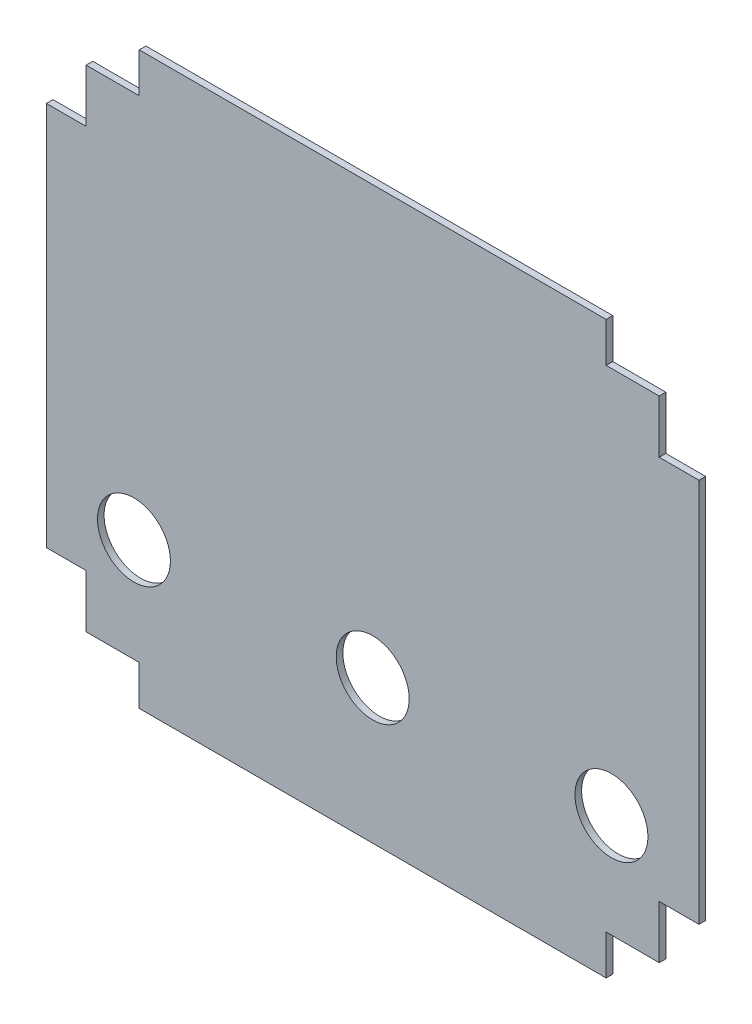
ISO-10303-21;
HEADER;
FILE_DESCRIPTION(('STEP AP214'),'2;1');
FILE_NAME('part.step','',(''),(''),'','','');
FILE_SCHEMA(('AUTOMOTIVE_DESIGN { 1 0 10303 214 1 1 1 1 }'));
ENDSEC;
DATA;
#1=APPLICATION_CONTEXT('core data for automotive mechanical design processes');
#2=APPLICATION_PROTOCOL_DEFINITION('international standard','automotive_design',2000,#1);
#3=PRODUCT_CONTEXT('',#1,'mechanical');
#4=PRODUCT('Part','Part','',(#3));
#5=PRODUCT_RELATED_PRODUCT_CATEGORY('part','',(#4));
#6=PRODUCT_DEFINITION_FORMATION('','',#4);
#7=PRODUCT_DEFINITION_CONTEXT('part definition',#1,'design');
#8=PRODUCT_DEFINITION('design','',#6,#7);
#9=PRODUCT_DEFINITION_SHAPE('','',#8);
#10=(LENGTH_UNIT() NAMED_UNIT(*) SI_UNIT(.MILLI.,.METRE.));
#11=(NAMED_UNIT(*) PLANE_ANGLE_UNIT() SI_UNIT($,.RADIAN.));
#12=(NAMED_UNIT(*) SI_UNIT($,.STERADIAN.) SOLID_ANGLE_UNIT());
#13=UNCERTAINTY_MEASURE_WITH_UNIT(LENGTH_MEASURE(1.E-05),#10,'distance_accuracy_value','');
#14=(GEOMETRIC_REPRESENTATION_CONTEXT(3) GLOBAL_UNCERTAINTY_ASSIGNED_CONTEXT((#13)) GLOBAL_UNIT_ASSIGNED_CONTEXT((#10,
#11,#12)) REPRESENTATION_CONTEXT('',''));
#15=CARTESIAN_POINT('',(0.,0.,0.));
#16=DIRECTION('',(0.,0.,1.));
#17=DIRECTION('',(1.,0.,0.));
#18=AXIS2_PLACEMENT_3D('',#15,#16,#17);
#19=CARTESIAN_POINT('',(0.,215.,5.));
#20=DIRECTION('',(0.,1.,0.));
#21=DIRECTION('',(0.,0.,1.));
#22=AXIS2_PLACEMENT_3D('',#19,#20,#21);
#23=PLANE('',#22);
#24=DIRECTION('',(1.,0.,0.));
#25=VECTOR('',#24,1.);
#26=CARTESIAN_POINT('',(0.,215.,0.));
#27=LINE('',#26,#25);
#28=CARTESIAN_POINT('',(-176.,215.,0.));
#29=VERTEX_POINT('',#28);
#30=CARTESIAN_POINT('',(176.,215.,0.));
#31=VERTEX_POINT('',#30);
#32=EDGE_CURVE('E208',#29,#31,#27,.T.);
#33=ORIENTED_EDGE('',*,*,#32,.F.);
#34=DIRECTION('',(0.,0.,-1.));
#35=VECTOR('',#34,1.);
#36=CARTESIAN_POINT('',(-176.,215.,5.));
#37=LINE('',#36,#35);
#38=CARTESIAN_POINT('',(-176.,215.,5.));
#39=VERTEX_POINT('',#38);
#40=EDGE_CURVE('E11',#39,#29,#37,.T.);
#41=ORIENTED_EDGE('',*,*,#40,.F.);
#42=DIRECTION('',(1.,0.,0.));
#43=VECTOR('',#42,1.);
#44=CARTESIAN_POINT('',(0.,215.,5.));
#45=LINE('',#44,#43);
#46=CARTESIAN_POINT('',(176.,215.,5.));
#47=VERTEX_POINT('',#46);
#48=EDGE_CURVE('E257',#39,#47,#45,.T.);
#49=ORIENTED_EDGE('',*,*,#48,.T.);
#50=DIRECTION('',(0.,0.,-1.));
#51=VECTOR('',#50,1.);
#52=CARTESIAN_POINT('',(176.,215.,5.));
#53=LINE('',#52,#51);
#54=EDGE_CURVE('E131',#47,#31,#53,.T.);
#55=ORIENTED_EDGE('',*,*,#54,.T.);
#56=EDGE_LOOP('',(#33,#41,#49,#55));
#57=FACE_BOUND('',#56,.T.);
#58=ADVANCED_FACE('F42',(#57),#23,.T.);
#59=CARTESIAN_POINT('',(-176.,0.,5.));
#60=DIRECTION('',(-1.,0.,0.));
#61=DIRECTION('',(0.,0.,1.));
#62=AXIS2_PLACEMENT_3D('',#59,#60,#61);
#63=PLANE('',#62);
#64=DIRECTION('',(0.,1.,0.));
#65=VECTOR('',#64,1.);
#66=CARTESIAN_POINT('',(-176.,0.,0.));
#67=LINE('',#66,#65);
#68=CARTESIAN_POINT('',(-176.,185.,0.));
#69=VERTEX_POINT('',#68);
#70=EDGE_CURVE('E211',#69,#29,#67,.T.);
#71=ORIENTED_EDGE('',*,*,#70,.F.);
#72=DIRECTION('',(0.,0.,-1.));
#73=VECTOR('',#72,1.);
#74=CARTESIAN_POINT('',(-176.,185.,5.));
#75=LINE('',#74,#73);
#76=CARTESIAN_POINT('',(-176.,185.,5.));
#77=VERTEX_POINT('',#76);
#78=EDGE_CURVE('E51',#77,#69,#75,.T.);
#79=ORIENTED_EDGE('',*,*,#78,.F.);
#80=DIRECTION('',(0.,1.,0.));
#81=VECTOR('',#80,1.);
#82=CARTESIAN_POINT('',(-176.,0.,5.));
#83=LINE('',#82,#81);
#84=EDGE_CURVE('E332',#77,#39,#83,.T.);
#85=ORIENTED_EDGE('',*,*,#84,.T.);
#86=ORIENTED_EDGE('',*,*,#40,.T.);
#87=EDGE_LOOP('',(#71,#79,#85,#86));
#88=FACE_BOUND('',#87,.T.);
#89=ADVANCED_FACE('F320',(#88),#63,.T.);
#90=CARTESIAN_POINT('',(0.,185.,5.));
#91=DIRECTION('',(0.,1.,0.));
#92=DIRECTION('',(0.,0.,1.));
#93=AXIS2_PLACEMENT_3D('',#90,#91,#92);
#94=PLANE('',#93);
#95=DIRECTION('',(1.,0.,0.));
#96=VECTOR('',#95,1.);
#97=CARTESIAN_POINT('',(0.,185.,0.));
#98=LINE('',#97,#96);
#99=CARTESIAN_POINT('',(-216.,185.,0.));
#100=VERTEX_POINT('',#99);
#101=EDGE_CURVE('E214',#100,#69,#98,.T.);
#102=ORIENTED_EDGE('',*,*,#101,.F.);
#103=DIRECTION('',(0.,0.,-1.));
#104=VECTOR('',#103,1.);
#105=CARTESIAN_POINT('',(-216.,185.,5.));
#106=LINE('',#105,#104);
#107=CARTESIAN_POINT('',(-216.,185.,5.));
#108=VERTEX_POINT('',#107);
#109=EDGE_CURVE('E292',#108,#100,#106,.T.);
#110=ORIENTED_EDGE('',*,*,#109,.F.);
#111=DIRECTION('',(1.,0.,0.));
#112=VECTOR('',#111,1.);
#113=CARTESIAN_POINT('',(0.,185.,5.));
#114=LINE('',#113,#112);
#115=EDGE_CURVE('E335',#108,#77,#114,.T.);
#116=ORIENTED_EDGE('',*,*,#115,.T.);
#117=ORIENTED_EDGE('',*,*,#78,.T.);
#118=EDGE_LOOP('',(#102,#110,#116,#117));
#119=FACE_BOUND('',#118,.T.);
#120=ADVANCED_FACE('F324',(#119),#94,.T.);
#121=CARTESIAN_POINT('',(-216.,0.,5.));
#122=DIRECTION('',(-1.,0.,0.));
#123=DIRECTION('',(0.,0.,1.));
#124=AXIS2_PLACEMENT_3D('',#121,#122,#123);
#125=PLANE('',#124);
#126=DIRECTION('',(0.,1.,0.));
#127=VECTOR('',#126,1.);
#128=CARTESIAN_POINT('',(-216.,0.,0.));
#129=LINE('',#128,#127);
#130=CARTESIAN_POINT('',(-216.,145.,0.));
#131=VERTEX_POINT('',#130);
#132=EDGE_CURVE('E217',#131,#100,#129,.T.);
#133=ORIENTED_EDGE('',*,*,#132,.F.);
#134=DIRECTION('',(0.,0.,-1.));
#135=VECTOR('',#134,1.);
#136=CARTESIAN_POINT('',(-216.,145.,5.));
#137=LINE('',#136,#135);
#138=CARTESIAN_POINT('',(-216.,145.,5.));
#139=VERTEX_POINT('',#138);
#140=EDGE_CURVE('E290',#139,#131,#137,.T.);
#141=ORIENTED_EDGE('',*,*,#140,.F.);
#142=DIRECTION('',(0.,1.,0.));
#143=VECTOR('',#142,1.);
#144=CARTESIAN_POINT('',(-216.,0.,5.));
#145=LINE('',#144,#143);
#146=EDGE_CURVE('E337',#139,#108,#145,.T.);
#147=ORIENTED_EDGE('',*,*,#146,.T.);
#148=ORIENTED_EDGE('',*,*,#109,.T.);
#149=EDGE_LOOP('',(#133,#141,#147,#148));
#150=FACE_BOUND('',#149,.T.);
#151=ADVANCED_FACE('F445',(#150),#125,.T.);
#152=CARTESIAN_POINT('',(0.,145.,5.));
#153=DIRECTION('',(0.,1.,0.));
#154=DIRECTION('',(0.,0.,1.));
#155=AXIS2_PLACEMENT_3D('',#152,#153,#154);
#156=PLANE('',#155);
#157=DIRECTION('',(1.,0.,0.));
#158=VECTOR('',#157,1.);
#159=CARTESIAN_POINT('',(0.,145.,0.));
#160=LINE('',#159,#158);
#161=CARTESIAN_POINT('',(-246.,145.,0.));
#162=VERTEX_POINT('',#161);
#163=EDGE_CURVE('E220',#162,#131,#160,.T.);
#164=ORIENTED_EDGE('',*,*,#163,.F.);
#165=DIRECTION('',(0.,0.,-1.));
#166=VECTOR('',#165,1.);
#167=CARTESIAN_POINT('',(-246.,145.,5.));
#168=LINE('',#167,#166);
#169=CARTESIAN_POINT('',(-246.,145.,5.));
#170=VERTEX_POINT('',#169);
#171=EDGE_CURVE('E288',#170,#162,#168,.T.);
#172=ORIENTED_EDGE('',*,*,#171,.F.);
#173=DIRECTION('',(1.,0.,0.));
#174=VECTOR('',#173,1.);
#175=CARTESIAN_POINT('',(0.,145.,5.));
#176=LINE('',#175,#174);
#177=EDGE_CURVE('E344',#170,#139,#176,.T.);
#178=ORIENTED_EDGE('',*,*,#177,.T.);
#179=ORIENTED_EDGE('',*,*,#140,.T.);
#180=EDGE_LOOP('',(#164,#172,#178,#179));
#181=FACE_BOUND('',#180,.T.);
#182=ADVANCED_FACE('F441',(#181),#156,.T.);
#183=CARTESIAN_POINT('',(-246.,0.,5.));
#184=DIRECTION('',(-1.,0.,0.));
#185=DIRECTION('',(0.,0.,1.));
#186=AXIS2_PLACEMENT_3D('',#183,#184,#185);
#187=PLANE('',#186);
#188=DIRECTION('',(0.,1.,0.));
#189=VECTOR('',#188,1.);
#190=CARTESIAN_POINT('',(-246.,0.,0.));
#191=LINE('',#190,#189);
#192=CARTESIAN_POINT('',(-246.,-145.,0.));
#193=VERTEX_POINT('',#192);
#194=EDGE_CURVE('E223',#193,#162,#191,.T.);
#195=ORIENTED_EDGE('',*,*,#194,.F.);
#196=DIRECTION('',(0.,0.,-1.));
#197=VECTOR('',#196,1.);
#198=CARTESIAN_POINT('',(-246.,-145.,5.));
#199=LINE('',#198,#197);
#200=CARTESIAN_POINT('',(-246.,-145.,5.));
#201=VERTEX_POINT('',#200);
#202=EDGE_CURVE('E286',#201,#193,#199,.T.);
#203=ORIENTED_EDGE('',*,*,#202,.F.);
#204=DIRECTION('',(0.,1.,0.));
#205=VECTOR('',#204,1.);
#206=CARTESIAN_POINT('',(-246.,0.,5.));
#207=LINE('',#206,#205);
#208=EDGE_CURVE('E347',#201,#170,#207,.T.);
#209=ORIENTED_EDGE('',*,*,#208,.T.);
#210=ORIENTED_EDGE('',*,*,#171,.T.);
#211=EDGE_LOOP('',(#195,#203,#209,#210));
#212=FACE_BOUND('',#211,.T.);
#213=ADVANCED_FACE('F437',(#212),#187,.T.);
#214=CARTESIAN_POINT('',(0.,-145.,5.));
#215=DIRECTION('',(0.,1.,0.));
#216=DIRECTION('',(0.,0.,1.));
#217=AXIS2_PLACEMENT_3D('',#214,#215,#216);
#218=PLANE('',#217);
#219=DIRECTION('',(1.,0.,0.));
#220=VECTOR('',#219,1.);
#221=CARTESIAN_POINT('',(0.,-145.,0.));
#222=LINE('',#221,#220);
#223=CARTESIAN_POINT('',(-216.,-145.,0.));
#224=VERTEX_POINT('',#223);
#225=EDGE_CURVE('E226',#193,#224,#222,.T.);
#226=ORIENTED_EDGE('',*,*,#225,.T.);
#227=DIRECTION('',(0.,0.,-1.));
#228=VECTOR('',#227,1.);
#229=CARTESIAN_POINT('',(-216.,-145.,5.));
#230=LINE('',#229,#228);
#231=CARTESIAN_POINT('',(-216.,-145.,5.));
#232=VERTEX_POINT('',#231);
#233=EDGE_CURVE('E283',#232,#224,#230,.T.);
#234=ORIENTED_EDGE('',*,*,#233,.F.);
#235=DIRECTION('',(1.,0.,0.));
#236=VECTOR('',#235,1.);
#237=CARTESIAN_POINT('',(0.,-145.,5.));
#238=LINE('',#237,#236);
#239=EDGE_CURVE('E350',#201,#232,#238,.T.);
#240=ORIENTED_EDGE('',*,*,#239,.F.);
#241=ORIENTED_EDGE('',*,*,#202,.T.);
#242=EDGE_LOOP('',(#226,#234,#240,#241));
#243=FACE_BOUND('',#242,.T.);
#244=ADVANCED_FACE('F433',(#243),#218,.F.);
#245=CARTESIAN_POINT('',(-216.,0.,5.));
#246=DIRECTION('',(1.,0.,0.));
#247=DIRECTION('',(0.,0.,-1.));
#248=AXIS2_PLACEMENT_3D('',#245,#246,#247);
#249=PLANE('',#248);
#250=DIRECTION('',(0.,-1.,0.));
#251=VECTOR('',#250,1.);
#252=CARTESIAN_POINT('',(-216.,0.,0.));
#253=LINE('',#252,#251);
#254=CARTESIAN_POINT('',(-216.,-185.,0.));
#255=VERTEX_POINT('',#254);
#256=EDGE_CURVE('E228',#224,#255,#253,.T.);
#257=ORIENTED_EDGE('',*,*,#256,.T.);
#258=DIRECTION('',(0.,0.,-1.));
#259=VECTOR('',#258,1.);
#260=CARTESIAN_POINT('',(-216.,-185.,5.));
#261=LINE('',#260,#259);
#262=CARTESIAN_POINT('',(-216.,-185.,5.));
#263=VERTEX_POINT('',#262);
#264=EDGE_CURVE('E280',#263,#255,#261,.T.);
#265=ORIENTED_EDGE('',*,*,#264,.F.);
#266=DIRECTION('',(0.,-1.,0.));
#267=VECTOR('',#266,1.);
#268=CARTESIAN_POINT('',(-216.,0.,5.));
#269=LINE('',#268,#267);
#270=EDGE_CURVE('E352',#232,#263,#269,.T.);
#271=ORIENTED_EDGE('',*,*,#270,.F.);
#272=ORIENTED_EDGE('',*,*,#233,.T.);
#273=EDGE_LOOP('',(#257,#265,#271,#272));
#274=FACE_BOUND('',#273,.T.);
#275=ADVANCED_FACE('F429',(#274),#249,.F.);
#276=CARTESIAN_POINT('',(0.,-185.,5.));
#277=DIRECTION('',(0.,1.,0.));
#278=DIRECTION('',(0.,0.,1.));
#279=AXIS2_PLACEMENT_3D('',#276,#277,#278);
#280=PLANE('',#279);
#281=DIRECTION('',(1.,0.,0.));
#282=VECTOR('',#281,1.);
#283=CARTESIAN_POINT('',(0.,-185.,0.));
#284=LINE('',#283,#282);
#285=CARTESIAN_POINT('',(-176.,-185.,0.));
#286=VERTEX_POINT('',#285);
#287=EDGE_CURVE('E230',#255,#286,#284,.T.);
#288=ORIENTED_EDGE('',*,*,#287,.T.);
#289=DIRECTION('',(0.,0.,-1.));
#290=VECTOR('',#289,1.);
#291=CARTESIAN_POINT('',(-176.,-185.,5.));
#292=LINE('',#291,#290);
#293=CARTESIAN_POINT('',(-176.,-185.,5.));
#294=VERTEX_POINT('',#293);
#295=EDGE_CURVE('E277',#294,#286,#292,.T.);
#296=ORIENTED_EDGE('',*,*,#295,.F.);
#297=DIRECTION('',(1.,0.,0.));
#298=VECTOR('',#297,1.);
#299=CARTESIAN_POINT('',(0.,-185.,5.));
#300=LINE('',#299,#298);
#301=EDGE_CURVE('E354',#263,#294,#300,.T.);
#302=ORIENTED_EDGE('',*,*,#301,.F.);
#303=ORIENTED_EDGE('',*,*,#264,.T.);
#304=EDGE_LOOP('',(#288,#296,#302,#303));
#305=FACE_BOUND('',#304,.T.);
#306=ADVANCED_FACE('F425',(#305),#280,.F.);
#307=CARTESIAN_POINT('',(-176.,0.,5.));
#308=DIRECTION('',(1.,0.,0.));
#309=DIRECTION('',(0.,0.,-1.));
#310=AXIS2_PLACEMENT_3D('',#307,#308,#309);
#311=PLANE('',#310);
#312=DIRECTION('',(0.,-1.,0.));
#313=VECTOR('',#312,1.);
#314=CARTESIAN_POINT('',(-176.,0.,0.));
#315=LINE('',#314,#313);
#316=CARTESIAN_POINT('',(-176.,-215.,0.));
#317=VERTEX_POINT('',#316);
#318=EDGE_CURVE('E232',#286,#317,#315,.T.);
#319=ORIENTED_EDGE('',*,*,#318,.T.);
#320=DIRECTION('',(0.,0.,-1.));
#321=VECTOR('',#320,1.);
#322=CARTESIAN_POINT('',(-176.,-215.,5.));
#323=LINE('',#322,#321);
#324=CARTESIAN_POINT('',(-176.,-215.,5.));
#325=VERTEX_POINT('',#324);
#326=EDGE_CURVE('E274',#325,#317,#323,.T.);
#327=ORIENTED_EDGE('',*,*,#326,.F.);
#328=DIRECTION('',(0.,-1.,0.));
#329=VECTOR('',#328,1.);
#330=CARTESIAN_POINT('',(-176.,0.,5.));
#331=LINE('',#330,#329);
#332=EDGE_CURVE('E356',#294,#325,#331,.T.);
#333=ORIENTED_EDGE('',*,*,#332,.F.);
#334=ORIENTED_EDGE('',*,*,#295,.T.);
#335=EDGE_LOOP('',(#319,#327,#333,#334));
#336=FACE_BOUND('',#335,.T.);
#337=ADVANCED_FACE('F421',(#336),#311,.F.);
#338=CARTESIAN_POINT('',(0.,-215.,5.));
#339=DIRECTION('',(0.,1.,0.));
#340=DIRECTION('',(0.,0.,1.));
#341=AXIS2_PLACEMENT_3D('',#338,#339,#340);
#342=PLANE('',#341);
#343=DIRECTION('',(1.,0.,0.));
#344=VECTOR('',#343,1.);
#345=CARTESIAN_POINT('',(0.,-215.,0.));
#346=LINE('',#345,#344);
#347=CARTESIAN_POINT('',(176.,-215.,0.));
#348=VERTEX_POINT('',#347);
#349=EDGE_CURVE('E234',#317,#348,#346,.T.);
#350=ORIENTED_EDGE('',*,*,#349,.T.);
#351=DIRECTION('',(0.,0.,-1.));
#352=VECTOR('',#351,1.);
#353=CARTESIAN_POINT('',(176.,-215.,5.));
#354=LINE('',#353,#352);
#355=CARTESIAN_POINT('',(176.,-215.,5.));
#356=VERTEX_POINT('',#355);
#357=EDGE_CURVE('E272',#356,#348,#354,.T.);
#358=ORIENTED_EDGE('',*,*,#357,.F.);
#359=DIRECTION('',(1.,0.,0.));
#360=VECTOR('',#359,1.);
#361=CARTESIAN_POINT('',(0.,-215.,5.));
#362=LINE('',#361,#360);
#363=EDGE_CURVE('E358',#325,#356,#362,.T.);
#364=ORIENTED_EDGE('',*,*,#363,.F.);
#365=ORIENTED_EDGE('',*,*,#326,.T.);
#366=EDGE_LOOP('',(#350,#358,#364,#365));
#367=FACE_BOUND('',#366,.T.);
#368=ADVANCED_FACE('F417',(#367),#342,.F.);
#369=CARTESIAN_POINT('',(176.,0.,5.));
#370=DIRECTION('',(1.,0.,0.));
#371=DIRECTION('',(0.,0.,-1.));
#372=AXIS2_PLACEMENT_3D('',#369,#370,#371);
#373=PLANE('',#372);
#374=DIRECTION('',(0.,-1.,0.));
#375=VECTOR('',#374,1.);
#376=CARTESIAN_POINT('',(176.,0.,0.));
#377=LINE('',#376,#375);
#378=CARTESIAN_POINT('',(176.,-185.,0.));
#379=VERTEX_POINT('',#378);
#380=EDGE_CURVE('E237',#379,#348,#377,.T.);
#381=ORIENTED_EDGE('',*,*,#380,.F.);
#382=DIRECTION('',(0.,0.,-1.));
#383=VECTOR('',#382,1.);
#384=CARTESIAN_POINT('',(176.,-185.,5.));
#385=LINE('',#384,#383);
#386=CARTESIAN_POINT('',(176.,-185.,5.));
#387=VERTEX_POINT('',#386);
#388=EDGE_CURVE('E270',#387,#379,#385,.T.);
#389=ORIENTED_EDGE('',*,*,#388,.F.);
#390=DIRECTION('',(0.,-1.,0.));
#391=VECTOR('',#390,1.);
#392=CARTESIAN_POINT('',(176.,0.,5.));
#393=LINE('',#392,#391);
#394=EDGE_CURVE('E360',#387,#356,#393,.T.);
#395=ORIENTED_EDGE('',*,*,#394,.T.);
#396=ORIENTED_EDGE('',*,*,#357,.T.);
#397=EDGE_LOOP('',(#381,#389,#395,#396));
#398=FACE_BOUND('',#397,.T.);
#399=ADVANCED_FACE('F413',(#398),#373,.T.);
#400=CARTESIAN_POINT('',(0.,-185.,5.));
#401=DIRECTION('',(0.,-1.,0.));
#402=DIRECTION('',(0.,0.,-1.));
#403=AXIS2_PLACEMENT_3D('',#400,#401,#402);
#404=PLANE('',#403);
#405=DIRECTION('',(-1.,0.,0.));
#406=VECTOR('',#405,1.);
#407=CARTESIAN_POINT('',(0.,-185.,0.));
#408=LINE('',#407,#406);
#409=CARTESIAN_POINT('',(216.,-185.,0.));
#410=VERTEX_POINT('',#409);
#411=EDGE_CURVE('E240',#410,#379,#408,.T.);
#412=ORIENTED_EDGE('',*,*,#411,.F.);
#413=DIRECTION('',(0.,0.,-1.));
#414=VECTOR('',#413,1.);
#415=CARTESIAN_POINT('',(216.,-185.,5.));
#416=LINE('',#415,#414);
#417=CARTESIAN_POINT('',(216.,-185.,5.));
#418=VERTEX_POINT('',#417);
#419=EDGE_CURVE('E268',#418,#410,#416,.T.);
#420=ORIENTED_EDGE('',*,*,#419,.F.);
#421=DIRECTION('',(-1.,0.,0.));
#422=VECTOR('',#421,1.);
#423=CARTESIAN_POINT('',(0.,-185.,5.));
#424=LINE('',#423,#422);
#425=EDGE_CURVE('E363',#418,#387,#424,.T.);
#426=ORIENTED_EDGE('',*,*,#425,.T.);
#427=ORIENTED_EDGE('',*,*,#388,.T.);
#428=EDGE_LOOP('',(#412,#420,#426,#427));
#429=FACE_BOUND('',#428,.T.);
#430=ADVANCED_FACE('F409',(#429),#404,.T.);
#431=CARTESIAN_POINT('',(216.,0.,5.));
#432=DIRECTION('',(1.,0.,0.));
#433=DIRECTION('',(0.,0.,-1.));
#434=AXIS2_PLACEMENT_3D('',#431,#432,#433);
#435=PLANE('',#434);
#436=DIRECTION('',(0.,-1.,0.));
#437=VECTOR('',#436,1.);
#438=CARTESIAN_POINT('',(216.,0.,0.));
#439=LINE('',#438,#437);
#440=CARTESIAN_POINT('',(216.,-145.,0.));
#441=VERTEX_POINT('',#440);
#442=EDGE_CURVE('E243',#441,#410,#439,.T.);
#443=ORIENTED_EDGE('',*,*,#442,.F.);
#444=DIRECTION('',(0.,0.,-1.));
#445=VECTOR('',#444,1.);
#446=CARTESIAN_POINT('',(216.,-145.,5.));
#447=LINE('',#446,#445);
#448=CARTESIAN_POINT('',(216.,-145.,5.));
#449=VERTEX_POINT('',#448);
#450=EDGE_CURVE('E266',#449,#441,#447,.T.);
#451=ORIENTED_EDGE('',*,*,#450,.F.);
#452=DIRECTION('',(0.,-1.,0.));
#453=VECTOR('',#452,1.);
#454=CARTESIAN_POINT('',(216.,0.,5.));
#455=LINE('',#454,#453);
#456=EDGE_CURVE('E366',#449,#418,#455,.T.);
#457=ORIENTED_EDGE('',*,*,#456,.T.);
#458=ORIENTED_EDGE('',*,*,#419,.T.);
#459=EDGE_LOOP('',(#443,#451,#457,#458));
#460=FACE_BOUND('',#459,.T.);
#461=ADVANCED_FACE('F405',(#460),#435,.T.);
#462=CARTESIAN_POINT('',(0.,-145.,5.));
#463=DIRECTION('',(0.,-1.,0.));
#464=DIRECTION('',(0.,0.,-1.));
#465=AXIS2_PLACEMENT_3D('',#462,#463,#464);
#466=PLANE('',#465);
#467=DIRECTION('',(-1.,0.,0.));
#468=VECTOR('',#467,1.);
#469=CARTESIAN_POINT('',(0.,-145.,0.));
#470=LINE('',#469,#468);
#471=CARTESIAN_POINT('',(246.,-145.,0.));
#472=VERTEX_POINT('',#471);
#473=EDGE_CURVE('E246',#472,#441,#470,.T.);
#474=ORIENTED_EDGE('',*,*,#473,.F.);
#475=DIRECTION('',(0.,0.,-1.));
#476=VECTOR('',#475,1.);
#477=CARTESIAN_POINT('',(246.,-145.,5.));
#478=LINE('',#477,#476);
#479=CARTESIAN_POINT('',(246.,-145.,5.));
#480=VERTEX_POINT('',#479);
#481=EDGE_CURVE('E264',#480,#472,#478,.T.);
#482=ORIENTED_EDGE('',*,*,#481,.F.);
#483=DIRECTION('',(-1.,0.,0.));
#484=VECTOR('',#483,1.);
#485=CARTESIAN_POINT('',(0.,-145.,5.));
#486=LINE('',#485,#484);
#487=EDGE_CURVE('E369',#480,#449,#486,.T.);
#488=ORIENTED_EDGE('',*,*,#487,.T.);
#489=ORIENTED_EDGE('',*,*,#450,.T.);
#490=EDGE_LOOP('',(#474,#482,#488,#489));
#491=FACE_BOUND('',#490,.T.);
#492=ADVANCED_FACE('F402',(#491),#466,.T.);
#493=CARTESIAN_POINT('',(246.,0.,5.));
#494=DIRECTION('',(-1.,0.,0.));
#495=DIRECTION('',(0.,0.,1.));
#496=AXIS2_PLACEMENT_3D('',#493,#494,#495);
#497=PLANE('',#496);
#498=DIRECTION('',(0.,1.,0.));
#499=VECTOR('',#498,1.);
#500=CARTESIAN_POINT('',(246.,0.,0.));
#501=LINE('',#500,#499);
#502=CARTESIAN_POINT('',(246.,145.,0.));
#503=VERTEX_POINT('',#502);
#504=EDGE_CURVE('E249',#472,#503,#501,.T.);
#505=ORIENTED_EDGE('',*,*,#504,.T.);
#506=DIRECTION('',(0.,0.,-1.));
#507=VECTOR('',#506,1.);
#508=CARTESIAN_POINT('',(246.,145.,5.));
#509=LINE('',#508,#507);
#510=CARTESIAN_POINT('',(246.,145.,5.));
#511=VERTEX_POINT('',#510);
#512=EDGE_CURVE('E261',#511,#503,#509,.T.);
#513=ORIENTED_EDGE('',*,*,#512,.F.);
#514=DIRECTION('',(0.,1.,0.));
#515=VECTOR('',#514,1.);
#516=CARTESIAN_POINT('',(246.,0.,5.));
#517=LINE('',#516,#515);
#518=EDGE_CURVE('E372',#480,#511,#517,.T.);
#519=ORIENTED_EDGE('',*,*,#518,.F.);
#520=ORIENTED_EDGE('',*,*,#481,.T.);
#521=EDGE_LOOP('',(#505,#513,#519,#520));
#522=FACE_BOUND('',#521,.T.);
#523=ADVANCED_FACE('F378',(#522),#497,.F.);
#524=CARTESIAN_POINT('',(0.,145.,5.));
#525=DIRECTION('',(0.,-1.,0.));
#526=DIRECTION('',(0.,0.,-1.));
#527=AXIS2_PLACEMENT_3D('',#524,#525,#526);
#528=PLANE('',#527);
#529=DIRECTION('',(-1.,0.,0.));
#530=VECTOR('',#529,1.);
#531=CARTESIAN_POINT('',(0.,145.,0.));
#532=LINE('',#531,#530);
#533=CARTESIAN_POINT('',(216.,145.,0.));
#534=VERTEX_POINT('',#533);
#535=EDGE_CURVE('E251',#503,#534,#532,.T.);
#536=ORIENTED_EDGE('',*,*,#535,.T.);
#537=DIRECTION('',(0.,0.,-1.));
#538=VECTOR('',#537,1.);
#539=CARTESIAN_POINT('',(216.,145.,5.));
#540=LINE('',#539,#538);
#541=CARTESIAN_POINT('',(216.,145.,5.));
#542=VERTEX_POINT('',#541);
#543=EDGE_CURVE('E200',#542,#534,#540,.T.);
#544=ORIENTED_EDGE('',*,*,#543,.F.);
#545=DIRECTION('',(-1.,0.,0.));
#546=VECTOR('',#545,1.);
#547=CARTESIAN_POINT('',(0.,145.,5.));
#548=LINE('',#547,#546);
#549=EDGE_CURVE('E191',#511,#542,#548,.T.);
#550=ORIENTED_EDGE('',*,*,#549,.F.);
#551=ORIENTED_EDGE('',*,*,#512,.T.);
#552=EDGE_LOOP('',(#536,#544,#550,#551));
#553=FACE_BOUND('',#552,.T.);
#554=ADVANCED_FACE('F382',(#553),#528,.F.);
#555=CARTESIAN_POINT('',(216.,0.,5.));
#556=DIRECTION('',(-1.,0.,0.));
#557=DIRECTION('',(0.,0.,1.));
#558=AXIS2_PLACEMENT_3D('',#555,#556,#557);
#559=PLANE('',#558);
#560=DIRECTION('',(0.,1.,0.));
#561=VECTOR('',#560,1.);
#562=CARTESIAN_POINT('',(216.,0.,0.));
#563=LINE('',#562,#561);
#564=CARTESIAN_POINT('',(216.,185.,0.));
#565=VERTEX_POINT('',#564);
#566=EDGE_CURVE('E199',#534,#565,#563,.T.);
#567=ORIENTED_EDGE('',*,*,#566,.T.);
#568=DIRECTION('',(0.,0.,-1.));
#569=VECTOR('',#568,1.);
#570=CARTESIAN_POINT('',(216.,185.,5.));
#571=LINE('',#570,#569);
#572=CARTESIAN_POINT('',(216.,185.,5.));
#573=VERTEX_POINT('',#572);
#574=EDGE_CURVE('E196',#573,#565,#571,.T.);
#575=ORIENTED_EDGE('',*,*,#574,.F.);
#576=DIRECTION('',(0.,1.,0.));
#577=VECTOR('',#576,1.);
#578=CARTESIAN_POINT('',(216.,0.,5.));
#579=LINE('',#578,#577);
#580=EDGE_CURVE('E185',#542,#573,#579,.T.);
#581=ORIENTED_EDGE('',*,*,#580,.F.);
#582=ORIENTED_EDGE('',*,*,#543,.T.);
#583=EDGE_LOOP('',(#567,#575,#581,#582));
#584=FACE_BOUND('',#583,.T.);
#585=ADVANCED_FACE('F197',(#584),#559,.F.);
#586=CARTESIAN_POINT('',(0.,185.,5.));
#587=DIRECTION('',(0.,-1.,0.));
#588=DIRECTION('',(0.,0.,-1.));
#589=AXIS2_PLACEMENT_3D('',#586,#587,#588);
#590=PLANE('',#589);
#591=DIRECTION('',(-1.,0.,0.));
#592=VECTOR('',#591,1.);
#593=CARTESIAN_POINT('',(0.,185.,0.));
#594=LINE('',#593,#592);
#595=CARTESIAN_POINT('',(176.,185.,0.));
#596=VERTEX_POINT('',#595);
#597=EDGE_CURVE('E124',#565,#596,#594,.T.);
#598=ORIENTED_EDGE('',*,*,#597,.T.);
#599=DIRECTION('',(0.,0.,-1.));
#600=VECTOR('',#599,1.);
#601=CARTESIAN_POINT('',(176.,185.,5.));
#602=LINE('',#601,#600);
#603=CARTESIAN_POINT('',(176.,185.,5.));
#604=VERTEX_POINT('',#603);
#605=EDGE_CURVE('E201',#604,#596,#602,.T.);
#606=ORIENTED_EDGE('',*,*,#605,.F.);
#607=DIRECTION('',(-1.,0.,0.));
#608=VECTOR('',#607,1.);
#609=CARTESIAN_POINT('',(0.,185.,5.));
#610=LINE('',#609,#608);
#611=EDGE_CURVE('E189',#573,#604,#610,.T.);
#612=ORIENTED_EDGE('',*,*,#611,.F.);
#613=ORIENTED_EDGE('',*,*,#574,.T.);
#614=EDGE_LOOP('',(#598,#606,#612,#613));
#615=FACE_BOUND('',#614,.T.);
#616=ADVANCED_FACE('F203',(#615),#590,.F.);
#617=CARTESIAN_POINT('',(176.,0.,5.));
#618=DIRECTION('',(-1.,0.,0.));
#619=DIRECTION('',(0.,0.,1.));
#620=AXIS2_PLACEMENT_3D('',#617,#618,#619);
#621=PLANE('',#620);
#622=DIRECTION('',(0.,1.,0.));
#623=VECTOR('',#622,1.);
#624=CARTESIAN_POINT('',(176.,0.,0.));
#625=LINE('',#624,#623);
#626=EDGE_CURVE('E255',#596,#31,#625,.T.);
#627=ORIENTED_EDGE('',*,*,#626,.T.);
#628=ORIENTED_EDGE('',*,*,#54,.F.);
#629=DIRECTION('',(0.,1.,0.));
#630=VECTOR('',#629,1.);
#631=CARTESIAN_POINT('',(176.,0.,5.));
#632=LINE('',#631,#630);
#633=EDGE_CURVE('E60',#604,#47,#632,.T.);
#634=ORIENTED_EDGE('',*,*,#633,.F.);
#635=ORIENTED_EDGE('',*,*,#605,.T.);
#636=EDGE_LOOP('',(#627,#628,#634,#635));
#637=FACE_BOUND('',#636,.T.);
#638=ADVANCED_FACE('F384',(#637),#621,.F.);
#639=CARTESIAN_POINT('',(0.,0.,5.));
#640=DIRECTION('',(0.,0.,1.));
#641=DIRECTION('',(1.,0.,0.));
#642=AXIS2_PLACEMENT_3D('',#639,#640,#641);
#643=PLANE('',#642);
#644=CARTESIAN_POINT('',(-180.,-107.,5.));
#645=DIRECTION('',(0.,0.,1.));
#646=DIRECTION('',(1.,0.,0.));
#647=AXIS2_PLACEMENT_3D('',#644,#645,#646);
#648=CIRCLE('',#647,27.5);
#649=CARTESIAN_POINT('',(-152.5,-107.,5.));
#650=VERTEX_POINT('',#649);
#651=EDGE_CURVE('E298',#650,#650,#648,.T.);
#652=ORIENTED_EDGE('',*,*,#651,.F.);
#653=EDGE_LOOP('',(#652));
#654=FACE_BOUND('',#653,.T.);
#655=CARTESIAN_POINT('',(0.,-107.,5.));
#656=DIRECTION('',(0.,0.,1.));
#657=DIRECTION('',(1.,0.,0.));
#658=AXIS2_PLACEMENT_3D('',#655,#656,#657);
#659=CIRCLE('',#658,27.5);
#660=CARTESIAN_POINT('',(27.5000000000001,-107.,5.));
#661=VERTEX_POINT('',#660);
#662=EDGE_CURVE('E622',#661,#661,#659,.T.);
#663=ORIENTED_EDGE('',*,*,#662,.F.);
#664=EDGE_LOOP('',(#663));
#665=FACE_BOUND('',#664,.T.);
#666=CARTESIAN_POINT('',(180.,-107.,5.));
#667=DIRECTION('',(0.,0.,1.));
#668=DIRECTION('',(1.,0.,0.));
#669=AXIS2_PLACEMENT_3D('',#666,#667,#668);
#670=CIRCLE('',#669,27.5);
#671=CARTESIAN_POINT('',(207.5,-107.,5.));
#672=VERTEX_POINT('',#671);
#673=EDGE_CURVE('E618',#672,#672,#670,.T.);
#674=ORIENTED_EDGE('',*,*,#673,.F.);
#675=EDGE_LOOP('',(#674));
#676=FACE_BOUND('',#675,.T.);
#677=ORIENTED_EDGE('',*,*,#48,.F.);
#678=ORIENTED_EDGE('',*,*,#84,.F.);
#679=ORIENTED_EDGE('',*,*,#115,.F.);
#680=ORIENTED_EDGE('',*,*,#146,.F.);
#681=ORIENTED_EDGE('',*,*,#177,.F.);
#682=ORIENTED_EDGE('',*,*,#208,.F.);
#683=ORIENTED_EDGE('',*,*,#239,.T.);
#684=ORIENTED_EDGE('',*,*,#270,.T.);
#685=ORIENTED_EDGE('',*,*,#301,.T.);
#686=ORIENTED_EDGE('',*,*,#332,.T.);
#687=ORIENTED_EDGE('',*,*,#363,.T.);
#688=ORIENTED_EDGE('',*,*,#394,.F.);
#689=ORIENTED_EDGE('',*,*,#425,.F.);
#690=ORIENTED_EDGE('',*,*,#456,.F.);
#691=ORIENTED_EDGE('',*,*,#487,.F.);
#692=ORIENTED_EDGE('',*,*,#518,.T.);
#693=ORIENTED_EDGE('',*,*,#549,.T.);
#694=ORIENTED_EDGE('',*,*,#580,.T.);
#695=ORIENTED_EDGE('',*,*,#611,.T.);
#696=ORIENTED_EDGE('',*,*,#633,.T.);
#697=EDGE_LOOP('',(#677,#678,#679,#680,#681,#682,#683,#684,#685,#686,#687,#688,#689,#690,#691,
#692,#693,#694,#695,#696));
#698=FACE_BOUND('',#697,.T.);
#699=ADVANCED_FACE('F187',(#654,#665,#676,#698),#643,.T.);
#700=CARTESIAN_POINT('',(0.,0.,0.));
#701=DIRECTION('',(0.,0.,1.));
#702=DIRECTION('',(1.,0.,0.));
#703=AXIS2_PLACEMENT_3D('',#700,#701,#702);
#704=PLANE('',#703);
#705=CARTESIAN_POINT('',(-180.,-107.,0.));
#706=DIRECTION('',(0.,0.,1.));
#707=DIRECTION('',(1.,0.,0.));
#708=AXIS2_PLACEMENT_3D('',#705,#706,#707);
#709=CIRCLE('',#708,27.5);
#710=CARTESIAN_POINT('',(-152.5,-107.,0.));
#711=VERTEX_POINT('',#710);
#712=EDGE_CURVE('E45',#711,#711,#709,.T.);
#713=ORIENTED_EDGE('',*,*,#712,.T.);
#714=EDGE_LOOP('',(#713));
#715=FACE_BOUND('',#714,.T.);
#716=CARTESIAN_POINT('',(0.,-107.,0.));
#717=DIRECTION('',(0.,0.,1.));
#718=DIRECTION('',(1.,0.,0.));
#719=AXIS2_PLACEMENT_3D('',#716,#717,#718);
#720=CIRCLE('',#719,27.5);
#721=CARTESIAN_POINT('',(27.5000000000001,-107.,0.));
#722=VERTEX_POINT('',#721);
#723=EDGE_CURVE('E297',#722,#722,#720,.T.);
#724=ORIENTED_EDGE('',*,*,#723,.T.);
#725=EDGE_LOOP('',(#724));
#726=FACE_BOUND('',#725,.T.);
#727=CARTESIAN_POINT('',(180.,-107.,0.));
#728=DIRECTION('',(0.,0.,1.));
#729=DIRECTION('',(1.,0.,0.));
#730=AXIS2_PLACEMENT_3D('',#727,#728,#729);
#731=CIRCLE('',#730,27.5);
#732=CARTESIAN_POINT('',(207.5,-107.,0.));
#733=VERTEX_POINT('',#732);
#734=EDGE_CURVE('E295',#733,#733,#731,.T.);
#735=ORIENTED_EDGE('',*,*,#734,.T.);
#736=EDGE_LOOP('',(#735));
#737=FACE_BOUND('',#736,.T.);
#738=ORIENTED_EDGE('',*,*,#32,.T.);
#739=ORIENTED_EDGE('',*,*,#626,.F.);
#740=ORIENTED_EDGE('',*,*,#597,.F.);
#741=ORIENTED_EDGE('',*,*,#566,.F.);
#742=ORIENTED_EDGE('',*,*,#535,.F.);
#743=ORIENTED_EDGE('',*,*,#504,.F.);
#744=ORIENTED_EDGE('',*,*,#473,.T.);
#745=ORIENTED_EDGE('',*,*,#442,.T.);
#746=ORIENTED_EDGE('',*,*,#411,.T.);
#747=ORIENTED_EDGE('',*,*,#380,.T.);
#748=ORIENTED_EDGE('',*,*,#349,.F.);
#749=ORIENTED_EDGE('',*,*,#318,.F.);
#750=ORIENTED_EDGE('',*,*,#287,.F.);
#751=ORIENTED_EDGE('',*,*,#256,.F.);
#752=ORIENTED_EDGE('',*,*,#225,.F.);
#753=ORIENTED_EDGE('',*,*,#194,.T.);
#754=ORIENTED_EDGE('',*,*,#163,.T.);
#755=ORIENTED_EDGE('',*,*,#132,.T.);
#756=ORIENTED_EDGE('',*,*,#101,.T.);
#757=ORIENTED_EDGE('',*,*,#70,.T.);
#758=EDGE_LOOP('',(#738,#739,#740,#741,#742,#743,#744,#745,#746,#747,#748,#749,#750,#751,#752,
#753,#754,#755,#756,#757));
#759=FACE_BOUND('',#758,.T.);
#760=ADVANCED_FACE('F305',(#715,#726,#737,#759),#704,.F.);
#761=CARTESIAN_POINT('',(180.,-107.,-5.));
#762=DIRECTION('',(0.,0.,1.));
#763=DIRECTION('',(1.,0.,0.));
#764=AXIS2_PLACEMENT_3D('',#761,#762,#763);
#765=CYLINDRICAL_SURFACE('',#764,27.5);
#766=ORIENTED_EDGE('',*,*,#673,.T.);
#767=EDGE_LOOP('',(#766));
#768=FACE_BOUND('',#767,.T.);
#769=ORIENTED_EDGE('',*,*,#734,.F.);
#770=EDGE_LOOP('',(#769));
#771=FACE_BOUND('',#770,.T.);
#772=ADVANCED_FACE('F315',(#768,#771),#765,.F.);
#773=CARTESIAN_POINT('',(0.,-107.,-5.));
#774=DIRECTION('',(0.,0.,1.));
#775=DIRECTION('',(1.,0.,0.));
#776=AXIS2_PLACEMENT_3D('',#773,#774,#775);
#777=CYLINDRICAL_SURFACE('',#776,27.5);
#778=ORIENTED_EDGE('',*,*,#662,.T.);
#779=EDGE_LOOP('',(#778));
#780=FACE_BOUND('',#779,.T.);
#781=ORIENTED_EDGE('',*,*,#723,.F.);
#782=EDGE_LOOP('',(#781));
#783=FACE_BOUND('',#782,.T.);
#784=ADVANCED_FACE('F309',(#780,#783),#777,.F.);
#785=CARTESIAN_POINT('',(-180.,-107.,-5.));
#786=DIRECTION('',(0.,0.,1.));
#787=DIRECTION('',(1.,0.,0.));
#788=AXIS2_PLACEMENT_3D('',#785,#786,#787);
#789=CYLINDRICAL_SURFACE('',#788,27.5);
#790=ORIENTED_EDGE('',*,*,#651,.T.);
#791=EDGE_LOOP('',(#790));
#792=FACE_BOUND('',#791,.T.);
#793=ORIENTED_EDGE('',*,*,#712,.F.);
#794=EDGE_LOOP('',(#793));
#795=FACE_BOUND('',#794,.T.);
#796=ADVANCED_FACE('F307',(#792,#795),#789,.F.);
#797=CLOSED_SHELL('',(#58,#89,#120,#151,#182,#213,#244,#275,#306,#337,#368,#399,#430,#461,#492,
#523,#554,#585,#616,#638,#699,#760,#772,#784,#796));
#798=MANIFOLD_SOLID_BREP('B2',#797);
#799=ADVANCED_BREP_SHAPE_REPRESENTATION('',(#18,#798),#14);
#800=SHAPE_DEFINITION_REPRESENTATION(#9,#799);
ENDSEC;
END-ISO-10303-21;
